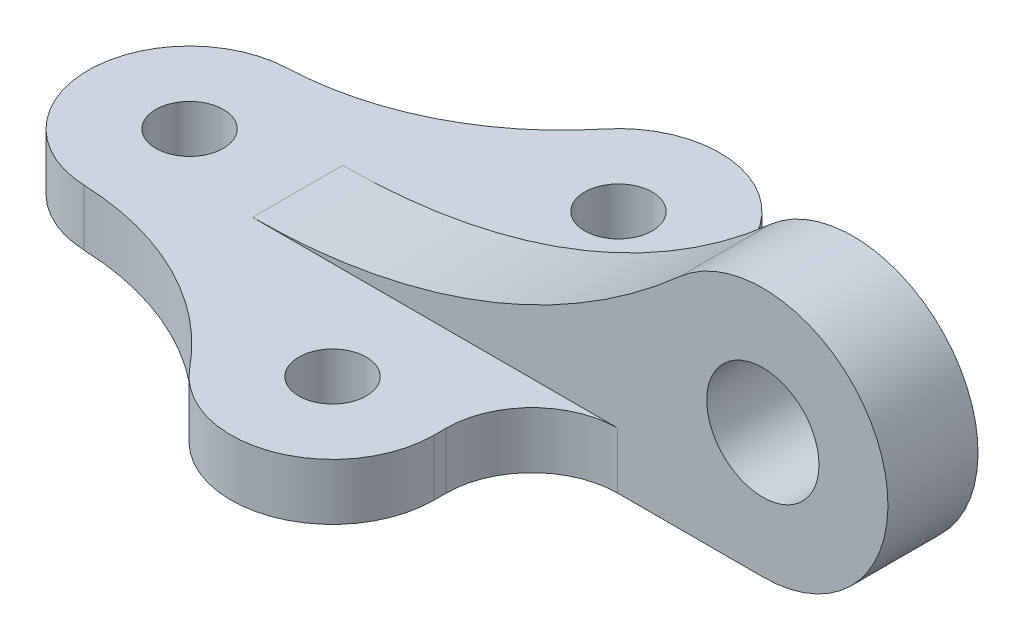
ISO-10303-21;
HEADER;
FILE_DESCRIPTION(('STEP AP214'),'2;1');
FILE_NAME('part.step','',(''),(''),'','','');
FILE_SCHEMA(('AUTOMOTIVE_DESIGN { 1 0 10303 214 1 1 1 1 }'));
ENDSEC;
DATA;
#1=APPLICATION_CONTEXT('core data for automotive mechanical design processes');
#2=APPLICATION_PROTOCOL_DEFINITION('international standard','automotive_design',2000,#1);
#3=PRODUCT_CONTEXT('',#1,'mechanical');
#4=PRODUCT('Part','Part','',(#3));
#5=PRODUCT_RELATED_PRODUCT_CATEGORY('part','',(#4));
#6=PRODUCT_DEFINITION_FORMATION('','',#4);
#7=PRODUCT_DEFINITION_CONTEXT('part definition',#1,'design');
#8=PRODUCT_DEFINITION('design','',#6,#7);
#9=PRODUCT_DEFINITION_SHAPE('','',#8);
#10=(LENGTH_UNIT() NAMED_UNIT(*) SI_UNIT(.MILLI.,.METRE.));
#11=(NAMED_UNIT(*) PLANE_ANGLE_UNIT() SI_UNIT($,.RADIAN.));
#12=(NAMED_UNIT(*) SI_UNIT($,.STERADIAN.) SOLID_ANGLE_UNIT());
#13=UNCERTAINTY_MEASURE_WITH_UNIT(LENGTH_MEASURE(1.E-05),#10,'distance_accuracy_value','');
#14=(GEOMETRIC_REPRESENTATION_CONTEXT(3) GLOBAL_UNCERTAINTY_ASSIGNED_CONTEXT((#13)) GLOBAL_UNIT_ASSIGNED_CONTEXT((#10,
#11,#12)) REPRESENTATION_CONTEXT('',''));
#15=CARTESIAN_POINT('',(0.,0.,0.));
#16=DIRECTION('',(0.,0.,1.));
#17=DIRECTION('',(1.,0.,0.));
#18=AXIS2_PLACEMENT_3D('',#15,#16,#17);
#19=CARTESIAN_POINT('',(68.834,5.0038,-25.4));
#20=DIRECTION('',(-1.,0.,0.));
#21=DIRECTION('',(0.,0.,1.));
#22=AXIS2_PLACEMENT_3D('',#19,#20,#21);
#23=PLANE('',#22);
#24=DIRECTION('',(0.,0.,-1.));
#25=VECTOR('',#24,1.);
#26=CARTESIAN_POINT('',(68.834,5.0038,-25.4));
#27=LINE('',#26,#25);
#28=CARTESIAN_POINT('',(68.834,5.0038,-23.241));
#29=VERTEX_POINT('',#28);
#30=CARTESIAN_POINT('',(68.834,5.0038,-25.4));
#31=VERTEX_POINT('',#30);
#32=EDGE_CURVE('E208',#29,#31,#27,.T.);
#33=ORIENTED_EDGE('',*,*,#32,.F.);
#34=DIRECTION('',(0.,-1.,0.));
#35=VECTOR('',#34,1.);
#36=CARTESIAN_POINT('',(68.834,-5.0038,-23.241));
#37=LINE('',#36,#35);
#38=CARTESIAN_POINT('',(68.834,-5.0038,-23.241));
#39=VERTEX_POINT('',#38);
#40=EDGE_CURVE('E263',#29,#39,#37,.T.);
#41=ORIENTED_EDGE('',*,*,#40,.T.);
#42=DIRECTION('',(0.,0.,-1.));
#43=VECTOR('',#42,1.);
#44=CARTESIAN_POINT('',(68.834,-5.0038,-25.4));
#45=LINE('',#44,#43);
#46=CARTESIAN_POINT('',(68.834,-5.0038,-25.4));
#47=VERTEX_POINT('',#46);
#48=EDGE_CURVE('E228',#39,#47,#45,.T.);
#49=ORIENTED_EDGE('',*,*,#48,.T.);
#50=DIRECTION('',(0.,-1.,0.));
#51=VECTOR('',#50,1.);
#52=CARTESIAN_POINT('',(68.834,5.0038,-25.4));
#53=LINE('',#52,#51);
#54=EDGE_CURVE('E251',#31,#47,#53,.T.);
#55=ORIENTED_EDGE('',*,*,#54,.F.);
#56=EDGE_LOOP('',(#33,#41,#49,#55));
#57=FACE_BOUND('',#56,.T.);
#58=ADVANCED_FACE('F43',(#57),#23,.F.);
#59=CARTESIAN_POINT('',(-2.641646014455,5.0038,68.78329202891));
#60=DIRECTION('',(0.,-1.,0.));
#61=DIRECTION('',(0.,0.,-1.));
#62=AXIS2_PLACEMENT_3D('',#59,#60,#61);
#63=PLANE('',#62);
#64=CARTESIAN_POINT('',(68.834,5.0038,25.4));
#65=VERTEX_POINT('',#64);
#66=CARTESIAN_POINT('',(68.834,5.0038,23.241));
#67=VERTEX_POINT('',#66);
#68=EDGE_CURVE('E209',#65,#67,#27,.T.);
#69=ORIENTED_EDGE('',*,*,#68,.T.);
#70=CARTESIAN_POINT('',(84.074,5.0038,23.241));
#71=DIRECTION('',(0.,-1.,0.));
#72=DIRECTION('',(0.,0.,-1.));
#73=AXIS2_PLACEMENT_3D('',#70,#71,#72);
#74=CIRCLE('',#73,15.24);
#75=CARTESIAN_POINT('',(84.074,5.00379999999999,8.001));
#76=VERTEX_POINT('',#75);
#77=EDGE_CURVE('E11',#67,#76,#74,.T.);
#78=ORIENTED_EDGE('',*,*,#77,.T.);
#79=DIRECTION('',(1.,0.,0.));
#80=VECTOR('',#79,1.);
#81=CARTESIAN_POINT('',(36.7986831475044,5.0038,8.001));
#82=LINE('',#81,#80);
#83=CARTESIAN_POINT('',(19.2006101325479,5.0038,8.001));
#84=VERTEX_POINT('',#83);
#85=EDGE_CURVE('E151',#84,#76,#82,.T.);
#86=ORIENTED_EDGE('',*,*,#85,.F.);
#87=DIRECTION('',(0.,0.,-1.));
#88=VECTOR('',#87,1.);
#89=CARTESIAN_POINT('',(19.2006101325479,5.0038,8.001));
#90=LINE('',#89,#88);
#91=CARTESIAN_POINT('',(19.2006101325479,5.0038,-8.001));
#92=VERTEX_POINT('',#91);
#93=EDGE_CURVE('E148',#84,#92,#90,.T.);
#94=ORIENTED_EDGE('',*,*,#93,.T.);
#95=DIRECTION('',(1.,0.,0.));
#96=VECTOR('',#95,1.);
#97=CARTESIAN_POINT('',(68.834,5.0038,-8.001));
#98=LINE('',#97,#96);
#99=CARTESIAN_POINT('',(84.074,5.0038,-8.001));
#100=VERTEX_POINT('',#99);
#101=EDGE_CURVE('E322',#92,#100,#98,.T.);
#102=ORIENTED_EDGE('',*,*,#101,.T.);
#103=CARTESIAN_POINT('',(84.074,5.0038,-23.241));
#104=DIRECTION('',(0.,-1.,0.));
#105=DIRECTION('',(0.,0.,-1.));
#106=AXIS2_PLACEMENT_3D('',#103,#104,#105);
#107=CIRCLE('',#106,15.24);
#108=EDGE_CURVE('E279',#100,#29,#107,.T.);
#109=ORIENTED_EDGE('',*,*,#108,.T.);
#110=ORIENTED_EDGE('',*,*,#32,.T.);
#111=CARTESIAN_POINT('',(50.8,5.0038,-25.4));
#112=DIRECTION('',(0.,1.,0.));
#113=DIRECTION('',(0.,0.,1.));
#114=AXIS2_PLACEMENT_3D('',#111,#112,#113);
#115=CIRCLE('',#114,18.034);
#116=CARTESIAN_POINT('',(36.7986831475044,5.0038,-36.7661023396775));
#117=VERTEX_POINT('',#116);
#118=EDGE_CURVE('E212',#31,#117,#115,.T.);
#119=ORIENTED_EDGE('',*,*,#118,.T.);
#120=CARTESIAN_POINT('',(-2.641646014455,5.0038,-68.78329202891));
#121=DIRECTION('',(0.,-1.,0.));
#122=DIRECTION('',(0.,0.,1.));
#123=AXIS2_PLACEMENT_3D('',#120,#121,#122);
#124=CIRCLE('',#123,50.8);
#125=CARTESIAN_POINT('',(-0.69209176024466,5.0038,-18.020714885803));
#126=VERTEX_POINT('',#125);
#127=EDGE_CURVE('E215',#117,#126,#124,.T.);
#128=ORIENTED_EDGE('',*,*,#127,.T.);
#129=CARTESIAN_POINT('',(0.,5.0038,0.));
#130=DIRECTION('',(0.,1.,0.));
#131=DIRECTION('',(0.,0.,1.));
#132=AXIS2_PLACEMENT_3D('',#129,#130,#131);
#133=CIRCLE('',#132,18.034);
#134=CARTESIAN_POINT('',(-0.692091760244675,5.0038,18.020714885803));
#135=VERTEX_POINT('',#134);
#136=EDGE_CURVE('E218',#126,#135,#133,.T.);
#137=ORIENTED_EDGE('',*,*,#136,.T.);
#138=CARTESIAN_POINT('',(-2.641646014455,5.0038,68.78329202891));
#139=DIRECTION('',(0.,-1.,0.));
#140=DIRECTION('',(0.,0.,-1.));
#141=AXIS2_PLACEMENT_3D('',#138,#139,#140);
#142=CIRCLE('',#141,50.8);
#143=CARTESIAN_POINT('',(36.7986831475044,5.0038,36.7661023396775));
#144=VERTEX_POINT('',#143);
#145=EDGE_CURVE('E200',#135,#144,#142,.T.);
#146=ORIENTED_EDGE('',*,*,#145,.T.);
#147=CARTESIAN_POINT('',(50.8,5.0038,25.4));
#148=DIRECTION('',(0.,1.,0.));
#149=DIRECTION('',(0.,0.,1.));
#150=AXIS2_PLACEMENT_3D('',#147,#148,#149);
#151=CIRCLE('',#150,18.034);
#152=EDGE_CURVE('E204',#144,#65,#151,.T.);
#153=ORIENTED_EDGE('',*,*,#152,.T.);
#154=EDGE_LOOP('',(#69,#78,#86,#94,#102,#109,#110,#119,#128,#137,#146,#153));
#155=FACE_BOUND('',#154,.T.);
#156=CARTESIAN_POINT('',(0.,5.0038,0.));
#157=DIRECTION('',(0.,1.,0.));
#158=DIRECTION('',(0.,0.,1.));
#159=AXIS2_PLACEMENT_3D('',#156,#157,#158);
#160=CIRCLE('',#159,5.9944);
#161=CARTESIAN_POINT('',(0.,5.0038,5.9944));
#162=VERTEX_POINT('',#161);
#163=EDGE_CURVE('E192',#162,#162,#160,.T.);
#164=ORIENTED_EDGE('',*,*,#163,.F.);
#165=EDGE_LOOP('',(#164));
#166=FACE_BOUND('',#165,.T.);
#167=CARTESIAN_POINT('',(50.8,5.0038,-25.4));
#168=DIRECTION('',(0.,1.,0.));
#169=DIRECTION('',(0.,0.,1.));
#170=AXIS2_PLACEMENT_3D('',#167,#168,#169);
#171=CIRCLE('',#170,5.9944);
#172=CARTESIAN_POINT('',(50.8,5.0038,-19.4056));
#173=VERTEX_POINT('',#172);
#174=EDGE_CURVE('E184',#173,#173,#171,.T.);
#175=ORIENTED_EDGE('',*,*,#174,.F.);
#176=EDGE_LOOP('',(#175));
#177=FACE_BOUND('',#176,.T.);
#178=CARTESIAN_POINT('',(50.8,5.0038,25.4));
#179=DIRECTION('',(0.,1.,0.));
#180=DIRECTION('',(0.,0.,1.));
#181=AXIS2_PLACEMENT_3D('',#178,#179,#180);
#182=CIRCLE('',#181,5.99440000000002);
#183=CARTESIAN_POINT('',(50.8,5.0038,31.3944));
#184=VERTEX_POINT('',#183);
#185=EDGE_CURVE('E174',#184,#184,#182,.T.);
#186=ORIENTED_EDGE('',*,*,#185,.F.);
#187=EDGE_LOOP('',(#186));
#188=FACE_BOUND('',#187,.T.);
#189=ADVANCED_FACE('F309',(#155,#166,#177,#188),#63,.F.);
#190=CARTESIAN_POINT('',(-2.641646014455,-5.0038,68.78329202891));
#191=DIRECTION('',(0.,-1.,0.));
#192=DIRECTION('',(0.,0.,-1.));
#193=AXIS2_PLACEMENT_3D('',#190,#191,#192);
#194=PLANE('',#193);
#195=CARTESIAN_POINT('',(50.8,-5.0038,-25.4));
#196=DIRECTION('',(0.,1.,0.));
#197=DIRECTION('',(0.,0.,1.));
#198=AXIS2_PLACEMENT_3D('',#195,#196,#197);
#199=CIRCLE('',#198,5.9944);
#200=CARTESIAN_POINT('',(50.8,-5.0038,-19.4056));
#201=VERTEX_POINT('',#200);
#202=EDGE_CURVE('E182',#201,#201,#199,.T.);
#203=ORIENTED_EDGE('',*,*,#202,.T.);
#204=EDGE_LOOP('',(#203));
#205=FACE_BOUND('',#204,.T.);
#206=CARTESIAN_POINT('',(-2.641646014455,-5.0038,68.78329202891));
#207=DIRECTION('',(0.,-1.,0.));
#208=DIRECTION('',(0.,0.,-1.));
#209=AXIS2_PLACEMENT_3D('',#206,#207,#208);
#210=CIRCLE('',#209,50.8);
#211=CARTESIAN_POINT('',(-0.692091760244675,-5.0038,18.020714885803));
#212=VERTEX_POINT('',#211);
#213=CARTESIAN_POINT('',(36.7986831475044,-5.0038,36.7661023396775));
#214=VERTEX_POINT('',#213);
#215=EDGE_CURVE('E196',#212,#214,#210,.T.);
#216=ORIENTED_EDGE('',*,*,#215,.F.);
#217=CARTESIAN_POINT('',(0.,-5.0038,0.));
#218=DIRECTION('',(0.,1.,0.));
#219=DIRECTION('',(0.,0.,1.));
#220=AXIS2_PLACEMENT_3D('',#217,#218,#219);
#221=CIRCLE('',#220,18.034);
#222=CARTESIAN_POINT('',(-0.69209176024466,-5.0038,-18.020714885803));
#223=VERTEX_POINT('',#222);
#224=EDGE_CURVE('E205',#223,#212,#221,.T.);
#225=ORIENTED_EDGE('',*,*,#224,.F.);
#226=CARTESIAN_POINT('',(-2.641646014455,-5.0038,-68.78329202891));
#227=DIRECTION('',(0.,-1.,0.));
#228=DIRECTION('',(0.,0.,1.));
#229=AXIS2_PLACEMENT_3D('',#226,#227,#228);
#230=CIRCLE('',#229,50.8);
#231=CARTESIAN_POINT('',(36.7986831475044,-5.0038,-36.7661023396775));
#232=VERTEX_POINT('',#231);
#233=EDGE_CURVE('E235',#232,#223,#230,.T.);
#234=ORIENTED_EDGE('',*,*,#233,.F.);
#235=CARTESIAN_POINT('',(50.8,-5.0038,-25.4));
#236=DIRECTION('',(0.,1.,0.));
#237=DIRECTION('',(0.,0.,1.));
#238=AXIS2_PLACEMENT_3D('',#235,#236,#237);
#239=CIRCLE('',#238,18.034);
#240=EDGE_CURVE('E232',#47,#232,#239,.T.);
#241=ORIENTED_EDGE('',*,*,#240,.F.);
#242=ORIENTED_EDGE('',*,*,#48,.F.);
#243=CARTESIAN_POINT('',(84.074,-5.0038,-23.241));
#244=DIRECTION('',(0.,-1.,0.));
#245=DIRECTION('',(0.,0.,-1.));
#246=AXIS2_PLACEMENT_3D('',#243,#244,#245);
#247=CIRCLE('',#246,15.24);
#248=CARTESIAN_POINT('',(84.074,-5.0038,-8.001));
#249=VERTEX_POINT('',#248);
#250=EDGE_CURVE('E276',#39,#249,#247,.F.);
#251=ORIENTED_EDGE('',*,*,#250,.T.);
#252=DIRECTION('',(1.,0.,0.));
#253=VECTOR('',#252,1.);
#254=CARTESIAN_POINT('',(109.855,-5.0038,-8.001));
#255=LINE('',#254,#253);
#256=CARTESIAN_POINT('',(109.855,-5.0038,-8.001));
#257=VERTEX_POINT('',#256);
#258=EDGE_CURVE('E163',#249,#257,#255,.T.);
#259=ORIENTED_EDGE('',*,*,#258,.T.);
#260=DIRECTION('',(0.,0.,-1.));
#261=VECTOR('',#260,1.);
#262=CARTESIAN_POINT('',(109.855,-5.0038,8.001));
#263=LINE('',#262,#261);
#264=CARTESIAN_POINT('',(109.855,-5.0038,8.001));
#265=VERTEX_POINT('',#264);
#266=EDGE_CURVE('E176',#265,#257,#263,.T.);
#267=ORIENTED_EDGE('',*,*,#266,.F.);
#268=DIRECTION('',(1.,0.,0.));
#269=VECTOR('',#268,1.);
#270=CARTESIAN_POINT('',(109.855,-5.0038,8.001));
#271=LINE('',#270,#269);
#272=CARTESIAN_POINT('',(84.074,-5.0038,8.001));
#273=VERTEX_POINT('',#272);
#274=EDGE_CURVE('E158',#273,#265,#271,.T.);
#275=ORIENTED_EDGE('',*,*,#274,.F.);
#276=CARTESIAN_POINT('',(84.074,-5.0038,23.241));
#277=DIRECTION('',(0.,-1.,0.));
#278=DIRECTION('',(0.,0.,-1.));
#279=AXIS2_PLACEMENT_3D('',#276,#277,#278);
#280=CIRCLE('',#279,15.24);
#281=CARTESIAN_POINT('',(68.834,-5.0038,23.241));
#282=VERTEX_POINT('',#281);
#283=EDGE_CURVE('E52',#273,#282,#280,.F.);
#284=ORIENTED_EDGE('',*,*,#283,.T.);
#285=CARTESIAN_POINT('',(68.834,-5.0038,25.4));
#286=VERTEX_POINT('',#285);
#287=EDGE_CURVE('E229',#286,#282,#45,.T.);
#288=ORIENTED_EDGE('',*,*,#287,.F.);
#289=CARTESIAN_POINT('',(50.8,-5.0038,25.4));
#290=DIRECTION('',(0.,1.,0.));
#291=DIRECTION('',(0.,0.,1.));
#292=AXIS2_PLACEMENT_3D('',#289,#290,#291);
#293=CIRCLE('',#292,18.034);
#294=EDGE_CURVE('E225',#214,#286,#293,.T.);
#295=ORIENTED_EDGE('',*,*,#294,.F.);
#296=EDGE_LOOP('',(#216,#225,#234,#241,#242,#251,#259,#267,#275,#284,#288,#295));
#297=FACE_BOUND('',#296,.T.);
#298=CARTESIAN_POINT('',(0.,-5.0038,0.));
#299=DIRECTION('',(0.,1.,0.));
#300=DIRECTION('',(0.,0.,1.));
#301=AXIS2_PLACEMENT_3D('',#298,#299,#300);
#302=CIRCLE('',#301,5.9944);
#303=CARTESIAN_POINT('',(0.,-5.0038,5.9944));
#304=VERTEX_POINT('',#303);
#305=EDGE_CURVE('E188',#304,#304,#302,.T.);
#306=ORIENTED_EDGE('',*,*,#305,.T.);
#307=EDGE_LOOP('',(#306));
#308=FACE_BOUND('',#307,.T.);
#309=CARTESIAN_POINT('',(50.8,-5.0038,25.4));
#310=DIRECTION('',(0.,1.,0.));
#311=DIRECTION('',(0.,0.,1.));
#312=AXIS2_PLACEMENT_3D('',#309,#310,#311);
#313=CIRCLE('',#312,5.99440000000002);
#314=CARTESIAN_POINT('',(50.8,-5.0038,31.3944));
#315=VERTEX_POINT('',#314);
#316=EDGE_CURVE('E169',#315,#315,#313,.T.);
#317=ORIENTED_EDGE('',*,*,#316,.T.);
#318=EDGE_LOOP('',(#317));
#319=FACE_BOUND('',#318,.T.);
#320=ADVANCED_FACE('F296',(#205,#297,#308,#319),#194,.T.);
#321=CARTESIAN_POINT('',(-2.641646014455,5.0038,68.78329202891));
#322=DIRECTION('',(0.,-1.,0.));
#323=DIRECTION('',(0.,0.,-1.));
#324=AXIS2_PLACEMENT_3D('',#321,#322,#323);
#325=CYLINDRICAL_SURFACE('',#324,50.8);
#326=ORIENTED_EDGE('',*,*,#215,.T.);
#327=DIRECTION('',(0.,-1.,0.));
#328=VECTOR('',#327,1.);
#329=CARTESIAN_POINT('',(36.7986831475044,5.0038,36.7661023396775));
#330=LINE('',#329,#328);
#331=EDGE_CURVE('E259',#144,#214,#330,.T.);
#332=ORIENTED_EDGE('',*,*,#331,.F.);
#333=ORIENTED_EDGE('',*,*,#145,.F.);
#334=DIRECTION('',(0.,-1.,0.));
#335=VECTOR('',#334,1.);
#336=CARTESIAN_POINT('',(-0.692091760244675,5.0038,18.020714885803));
#337=LINE('',#336,#335);
#338=EDGE_CURVE('E221',#135,#212,#337,.T.);
#339=ORIENTED_EDGE('',*,*,#338,.T.);
#340=EDGE_LOOP('',(#326,#332,#333,#339));
#341=FACE_BOUND('',#340,.T.);
#342=ADVANCED_FACE('F360',(#341),#325,.F.);
#343=CARTESIAN_POINT('',(50.8,5.0038,25.4));
#344=DIRECTION('',(0.,-1.,0.));
#345=DIRECTION('',(0.,0.,-1.));
#346=AXIS2_PLACEMENT_3D('',#343,#344,#345);
#347=CYLINDRICAL_SURFACE('',#346,18.034);
#348=ORIENTED_EDGE('',*,*,#294,.T.);
#349=DIRECTION('',(0.,-1.,0.));
#350=VECTOR('',#349,1.);
#351=CARTESIAN_POINT('',(68.834,5.0038,25.4));
#352=LINE('',#351,#350);
#353=EDGE_CURVE('E255',#65,#286,#352,.T.);
#354=ORIENTED_EDGE('',*,*,#353,.F.);
#355=ORIENTED_EDGE('',*,*,#152,.F.);
#356=ORIENTED_EDGE('',*,*,#331,.T.);
#357=EDGE_LOOP('',(#348,#354,#355,#356));
#358=FACE_BOUND('',#357,.T.);
#359=ADVANCED_FACE('F355',(#358),#347,.T.);
#360=ORIENTED_EDGE('',*,*,#287,.T.);
#361=DIRECTION('',(0.,-1.,0.));
#362=VECTOR('',#361,1.);
#363=CARTESIAN_POINT('',(68.834,5.0038,23.241));
#364=LINE('',#363,#362);
#365=EDGE_CURVE('E59',#282,#67,#364,.F.);
#366=ORIENTED_EDGE('',*,*,#365,.T.);
#367=ORIENTED_EDGE('',*,*,#68,.F.);
#368=ORIENTED_EDGE('',*,*,#353,.T.);
#369=EDGE_LOOP('',(#360,#366,#367,#368));
#370=FACE_BOUND('',#369,.T.);
#371=ADVANCED_FACE('F347',(#370),#23,.F.);
#372=CARTESIAN_POINT('',(50.8,5.0038,-25.4));
#373=DIRECTION('',(0.,-1.,0.));
#374=DIRECTION('',(0.,0.,-1.));
#375=AXIS2_PLACEMENT_3D('',#372,#373,#374);
#376=CYLINDRICAL_SURFACE('',#375,18.034);
#377=ORIENTED_EDGE('',*,*,#240,.T.);
#378=DIRECTION('',(0.,-1.,0.));
#379=VECTOR('',#378,1.);
#380=CARTESIAN_POINT('',(36.7986831475044,5.0038,-36.7661023396775));
#381=LINE('',#380,#379);
#382=EDGE_CURVE('E247',#117,#232,#381,.T.);
#383=ORIENTED_EDGE('',*,*,#382,.F.);
#384=ORIENTED_EDGE('',*,*,#118,.F.);
#385=ORIENTED_EDGE('',*,*,#54,.T.);
#386=EDGE_LOOP('',(#377,#383,#384,#385));
#387=FACE_BOUND('',#386,.T.);
#388=ADVANCED_FACE('F292',(#387),#376,.T.);
#389=CARTESIAN_POINT('',(-2.641646014455,5.0038,-68.78329202891));
#390=DIRECTION('',(0.,-1.,0.));
#391=DIRECTION('',(0.,0.,-1.));
#392=AXIS2_PLACEMENT_3D('',#389,#390,#391);
#393=CYLINDRICAL_SURFACE('',#392,50.8);
#394=ORIENTED_EDGE('',*,*,#233,.T.);
#395=DIRECTION('',(0.,-1.,0.));
#396=VECTOR('',#395,1.);
#397=CARTESIAN_POINT('',(-0.69209176024466,5.0038,-18.020714885803));
#398=LINE('',#397,#396);
#399=EDGE_CURVE('E243',#126,#223,#398,.T.);
#400=ORIENTED_EDGE('',*,*,#399,.F.);
#401=ORIENTED_EDGE('',*,*,#127,.F.);
#402=ORIENTED_EDGE('',*,*,#382,.T.);
#403=EDGE_LOOP('',(#394,#400,#401,#402));
#404=FACE_BOUND('',#403,.T.);
#405=ADVANCED_FACE('F301',(#404),#393,.F.);
#406=CARTESIAN_POINT('',(0.,5.0038,0.));
#407=DIRECTION('',(0.,-1.,0.));
#408=DIRECTION('',(0.,0.,-1.));
#409=AXIS2_PLACEMENT_3D('',#406,#407,#408);
#410=CYLINDRICAL_SURFACE('',#409,18.034);
#411=ORIENTED_EDGE('',*,*,#224,.T.);
#412=ORIENTED_EDGE('',*,*,#338,.F.);
#413=ORIENTED_EDGE('',*,*,#136,.F.);
#414=ORIENTED_EDGE('',*,*,#399,.T.);
#415=EDGE_LOOP('',(#411,#412,#413,#414));
#416=FACE_BOUND('',#415,.T.);
#417=ADVANCED_FACE('F305',(#416),#410,.T.);
#418=CARTESIAN_POINT('',(0.,5.0038,0.));
#419=DIRECTION('',(0.,-1.,0.));
#420=DIRECTION('',(0.,0.,-1.));
#421=AXIS2_PLACEMENT_3D('',#418,#419,#420);
#422=CYLINDRICAL_SURFACE('',#421,5.9944);
#423=ORIENTED_EDGE('',*,*,#163,.T.);
#424=EDGE_LOOP('',(#423));
#425=FACE_BOUND('',#424,.T.);
#426=ORIENTED_EDGE('',*,*,#305,.F.);
#427=EDGE_LOOP('',(#426));
#428=FACE_BOUND('',#427,.T.);
#429=ADVANCED_FACE('F377',(#425,#428),#422,.F.);
#430=CARTESIAN_POINT('',(50.8,5.0038,-25.4));
#431=DIRECTION('',(0.,-1.,0.));
#432=DIRECTION('',(0.,0.,-1.));
#433=AXIS2_PLACEMENT_3D('',#430,#431,#432);
#434=CYLINDRICAL_SURFACE('',#433,5.9944);
#435=ORIENTED_EDGE('',*,*,#174,.T.);
#436=EDGE_LOOP('',(#435));
#437=FACE_BOUND('',#436,.T.);
#438=ORIENTED_EDGE('',*,*,#202,.F.);
#439=EDGE_LOOP('',(#438));
#440=FACE_BOUND('',#439,.T.);
#441=ADVANCED_FACE('F393',(#437,#440),#434,.F.);
#442=CARTESIAN_POINT('',(50.8,5.0038,25.4));
#443=DIRECTION('',(0.,-1.,0.));
#444=DIRECTION('',(0.,0.,-1.));
#445=AXIS2_PLACEMENT_3D('',#442,#443,#444);
#446=CYLINDRICAL_SURFACE('',#445,5.99440000000002);
#447=ORIENTED_EDGE('',*,*,#185,.T.);
#448=EDGE_LOOP('',(#447));
#449=FACE_BOUND('',#448,.T.);
#450=ORIENTED_EDGE('',*,*,#316,.F.);
#451=EDGE_LOOP('',(#450));
#452=FACE_BOUND('',#451,.T.);
#453=ADVANCED_FACE('F400',(#449,#452),#446,.F.);
#454=CARTESIAN_POINT('',(109.855,17.2212,8.001));
#455=DIRECTION('',(0.,0.,1.));
#456=DIRECTION('',(1.,0.,0.));
#457=AXIS2_PLACEMENT_3D('',#454,#455,#456);
#458=PLANE('',#457);
#459=ORIENTED_EDGE('',*,*,#85,.T.);
#460=DIRECTION('',(0.,-1.,0.));
#461=VECTOR('',#460,1.);
#462=CARTESIAN_POINT('',(84.074,17.2212,8.001));
#463=LINE('',#462,#461);
#464=EDGE_CURVE('E271',#76,#273,#463,.T.);
#465=ORIENTED_EDGE('',*,*,#464,.T.);
#466=ORIENTED_EDGE('',*,*,#274,.T.);
#467=CARTESIAN_POINT('',(109.855,17.2212,8.001));
#468=DIRECTION('',(0.,0.,1.));
#469=DIRECTION('',(1.,0.,0.));
#470=AXIS2_PLACEMENT_3D('',#467,#468,#469);
#471=CIRCLE('',#470,22.225);
#472=CARTESIAN_POINT('',(95.0973086262287,33.8392976744186,8.001));
#473=VERTEX_POINT('',#472);
#474=EDGE_CURVE('E152',#265,#473,#471,.T.);
#475=ORIENTED_EDGE('',*,*,#474,.T.);
#476=CARTESIAN_POINT('',(19.2006101325479,119.3038,8.001));
#477=DIRECTION('',(0.,0.,-1.));
#478=DIRECTION('',(1.,0.,0.));
#479=AXIS2_PLACEMENT_3D('',#476,#477,#478);
#480=CIRCLE('',#479,114.3);
#481=EDGE_CURVE('E141',#473,#84,#480,.T.);
#482=ORIENTED_EDGE('',*,*,#481,.T.);
#483=EDGE_LOOP('',(#459,#465,#466,#475,#482));
#484=FACE_BOUND('',#483,.T.);
#485=CARTESIAN_POINT('',(109.855,17.2212,8.001));
#486=DIRECTION('',(0.,0.,1.));
#487=DIRECTION('',(1.,0.,0.));
#488=AXIS2_PLACEMENT_3D('',#485,#486,#487);
#489=CIRCLE('',#488,9.9695);
#490=CARTESIAN_POINT('',(119.8245,17.2212,8.001));
#491=VERTEX_POINT('',#490);
#492=EDGE_CURVE('E335',#491,#491,#489,.T.);
#493=ORIENTED_EDGE('',*,*,#492,.F.);
#494=EDGE_LOOP('',(#493));
#495=FACE_BOUND('',#494,.T.);
#496=ADVANCED_FACE('F155',(#484,#495),#458,.T.);
#497=CARTESIAN_POINT('',(109.855,17.2212,-8.001));
#498=DIRECTION('',(0.,0.,1.));
#499=DIRECTION('',(1.,0.,0.));
#500=AXIS2_PLACEMENT_3D('',#497,#498,#499);
#501=PLANE('',#500);
#502=ORIENTED_EDGE('',*,*,#258,.F.);
#503=DIRECTION('',(0.,-1.,0.));
#504=VECTOR('',#503,1.);
#505=CARTESIAN_POINT('',(84.074,5.0038,-8.001));
#506=LINE('',#505,#504);
#507=EDGE_CURVE('E267',#249,#100,#506,.F.);
#508=ORIENTED_EDGE('',*,*,#507,.T.);
#509=ORIENTED_EDGE('',*,*,#101,.F.);
#510=CARTESIAN_POINT('',(19.2006101325479,119.3038,-8.001));
#511=DIRECTION('',(0.,0.,-1.));
#512=DIRECTION('',(1.,0.,0.));
#513=AXIS2_PLACEMENT_3D('',#510,#511,#512);
#514=CIRCLE('',#513,114.3);
#515=CARTESIAN_POINT('',(95.0973086262287,33.8392976744186,-8.001));
#516=VERTEX_POINT('',#515);
#517=EDGE_CURVE('E325',#516,#92,#514,.T.);
#518=ORIENTED_EDGE('',*,*,#517,.F.);
#519=CARTESIAN_POINT('',(109.855,17.2212,-8.001));
#520=DIRECTION('',(0.,0.,1.));
#521=DIRECTION('',(1.,0.,0.));
#522=AXIS2_PLACEMENT_3D('',#519,#520,#521);
#523=CIRCLE('',#522,22.225);
#524=EDGE_CURVE('E167',#257,#516,#523,.T.);
#525=ORIENTED_EDGE('',*,*,#524,.F.);
#526=EDGE_LOOP('',(#502,#508,#509,#518,#525));
#527=FACE_BOUND('',#526,.T.);
#528=CARTESIAN_POINT('',(109.855,17.2212,-8.001));
#529=DIRECTION('',(0.,0.,1.));
#530=DIRECTION('',(1.,0.,0.));
#531=AXIS2_PLACEMENT_3D('',#528,#529,#530);
#532=CIRCLE('',#531,9.9695);
#533=CARTESIAN_POINT('',(119.8245,17.2212,-8.001));
#534=VERTEX_POINT('',#533);
#535=EDGE_CURVE('E550',#534,#534,#532,.T.);
#536=ORIENTED_EDGE('',*,*,#535,.T.);
#537=EDGE_LOOP('',(#536));
#538=FACE_BOUND('',#537,.T.);
#539=ADVANCED_FACE('F318',(#527,#538),#501,.F.);
#540=CARTESIAN_POINT('',(109.855,17.2212,8.001));
#541=DIRECTION('',(0.,0.,-1.));
#542=DIRECTION('',(-1.,0.,0.));
#543=AXIS2_PLACEMENT_3D('',#540,#541,#542);
#544=CYLINDRICAL_SURFACE('',#543,22.225);
#545=ORIENTED_EDGE('',*,*,#524,.T.);
#546=DIRECTION('',(0.,0.,-1.));
#547=VECTOR('',#546,1.);
#548=CARTESIAN_POINT('',(95.0973086262287,33.8392976744186,8.001));
#549=LINE('',#548,#547);
#550=EDGE_CURVE('E146',#473,#516,#549,.T.);
#551=ORIENTED_EDGE('',*,*,#550,.F.);
#552=ORIENTED_EDGE('',*,*,#474,.F.);
#553=ORIENTED_EDGE('',*,*,#266,.T.);
#554=EDGE_LOOP('',(#545,#551,#552,#553));
#555=FACE_BOUND('',#554,.T.);
#556=ADVANCED_FACE('F165',(#555),#544,.T.);
#557=CARTESIAN_POINT('',(19.2006101325479,119.3038,8.001));
#558=DIRECTION('',(0.,0.,-1.));
#559=DIRECTION('',(-1.,0.,0.));
#560=AXIS2_PLACEMENT_3D('',#557,#558,#559);
#561=CYLINDRICAL_SURFACE('',#560,114.3);
#562=ORIENTED_EDGE('',*,*,#517,.T.);
#563=ORIENTED_EDGE('',*,*,#93,.F.);
#564=ORIENTED_EDGE('',*,*,#481,.F.);
#565=ORIENTED_EDGE('',*,*,#550,.T.);
#566=EDGE_LOOP('',(#562,#563,#564,#565));
#567=FACE_BOUND('',#566,.T.);
#568=ADVANCED_FACE('F144',(#567),#561,.F.);
#569=CARTESIAN_POINT('',(109.855,17.2212,8.001));
#570=DIRECTION('',(0.,0.,-1.));
#571=DIRECTION('',(-1.,0.,0.));
#572=AXIS2_PLACEMENT_3D('',#569,#570,#571);
#573=CYLINDRICAL_SURFACE('',#572,9.9695);
#574=ORIENTED_EDGE('',*,*,#492,.T.);
#575=EDGE_LOOP('',(#574));
#576=FACE_BOUND('',#575,.T.);
#577=ORIENTED_EDGE('',*,*,#535,.F.);
#578=EDGE_LOOP('',(#577));
#579=FACE_BOUND('',#578,.T.);
#580=ADVANCED_FACE('F344',(#576,#579),#573,.F.);
#581=CARTESIAN_POINT('',(84.074,5.0038,-23.241));
#582=DIRECTION('',(0.,1.,0.));
#583=DIRECTION('',(0.,0.,1.));
#584=AXIS2_PLACEMENT_3D('',#581,#582,#583);
#585=CYLINDRICAL_SURFACE('',#584,15.24);
#586=ORIENTED_EDGE('',*,*,#108,.F.);
#587=ORIENTED_EDGE('',*,*,#507,.F.);
#588=ORIENTED_EDGE('',*,*,#250,.F.);
#589=ORIENTED_EDGE('',*,*,#40,.F.);
#590=EDGE_LOOP('',(#586,#587,#588,#589));
#591=FACE_BOUND('',#590,.T.);
#592=ADVANCED_FACE('F314',(#591),#585,.F.);
#593=CARTESIAN_POINT('',(84.074,17.2212,23.241));
#594=DIRECTION('',(0.,-1.,0.));
#595=DIRECTION('',(0.,0.,-1.));
#596=AXIS2_PLACEMENT_3D('',#593,#594,#595);
#597=CYLINDRICAL_SURFACE('',#596,15.24);
#598=ORIENTED_EDGE('',*,*,#77,.F.);
#599=ORIENTED_EDGE('',*,*,#365,.F.);
#600=ORIENTED_EDGE('',*,*,#283,.F.);
#601=ORIENTED_EDGE('',*,*,#464,.F.);
#602=EDGE_LOOP('',(#598,#599,#600,#601));
#603=FACE_BOUND('',#602,.T.);
#604=ADVANCED_FACE('F45',(#603),#597,.F.);
#605=CLOSED_SHELL('',(#58,#189,#320,#342,#359,#371,#388,#405,#417,#429,#441,#453,#496,#539,#556,
#568,#580,#592,#604));
#606=MANIFOLD_SOLID_BREP('B2',#605);
#607=ADVANCED_BREP_SHAPE_REPRESENTATION('',(#18,#606),#14);
#608=SHAPE_DEFINITION_REPRESENTATION(#9,#607);
ENDSEC;
END-ISO-10303-21;
